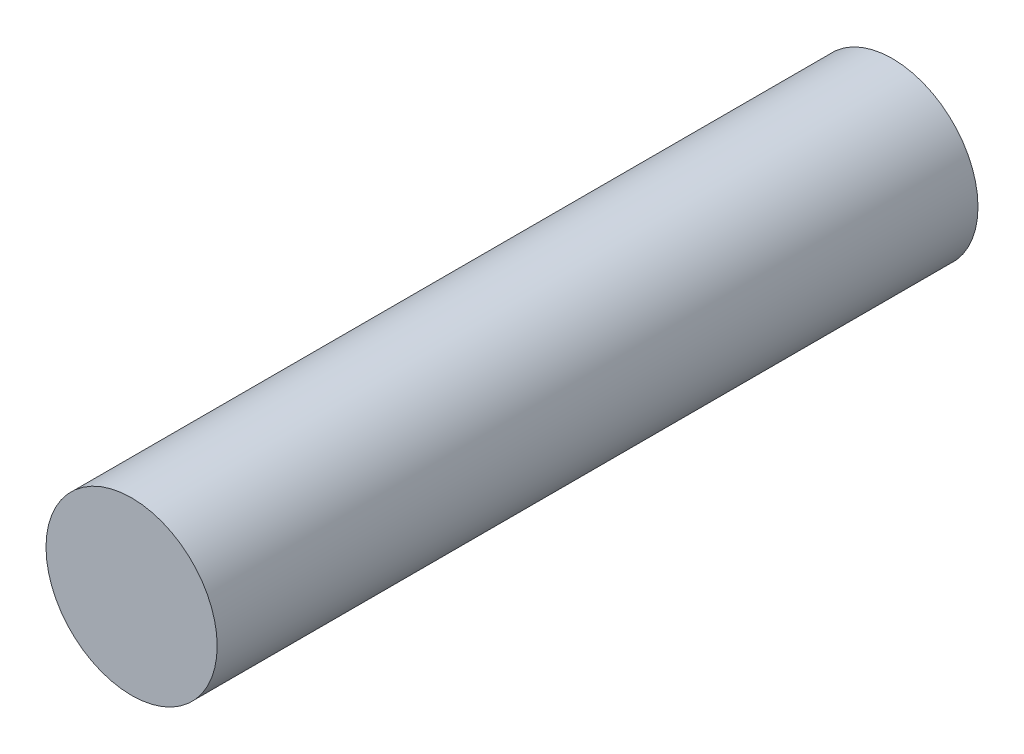
ISO-10303-21;
HEADER;
FILE_DESCRIPTION(('STEP AP214'),'2;1');
FILE_NAME('part.step','',(''),(''),'','','');
FILE_SCHEMA(('AUTOMOTIVE_DESIGN { 1 0 10303 214 1 1 1 1 }'));
ENDSEC;
DATA;
#1=APPLICATION_CONTEXT('core data for automotive mechanical design processes');
#2=APPLICATION_PROTOCOL_DEFINITION('international standard','automotive_design',2000,#1);
#3=PRODUCT_CONTEXT('',#1,'mechanical');
#4=PRODUCT('Part','Part','',(#3));
#5=PRODUCT_RELATED_PRODUCT_CATEGORY('part','',(#4));
#6=PRODUCT_DEFINITION_FORMATION('','',#4);
#7=PRODUCT_DEFINITION_CONTEXT('part definition',#1,'design');
#8=PRODUCT_DEFINITION('design','',#6,#7);
#9=PRODUCT_DEFINITION_SHAPE('','',#8);
#10=(LENGTH_UNIT() NAMED_UNIT(*) SI_UNIT(.MILLI.,.METRE.));
#11=(NAMED_UNIT(*) PLANE_ANGLE_UNIT() SI_UNIT($,.RADIAN.));
#12=(NAMED_UNIT(*) SI_UNIT($,.STERADIAN.) SOLID_ANGLE_UNIT());
#13=UNCERTAINTY_MEASURE_WITH_UNIT(LENGTH_MEASURE(1.E-05),#10,'distance_accuracy_value','');
#14=(GEOMETRIC_REPRESENTATION_CONTEXT(3) GLOBAL_UNCERTAINTY_ASSIGNED_CONTEXT((#13)) GLOBAL_UNIT_ASSIGNED_CONTEXT((#10,
#11,#12)) REPRESENTATION_CONTEXT('',''));
#15=CARTESIAN_POINT('',(0.,0.,0.));
#16=DIRECTION('',(0.,0.,1.));
#17=DIRECTION('',(1.,0.,0.));
#18=AXIS2_PLACEMENT_3D('',#15,#16,#17);
#19=CARTESIAN_POINT('',(0.,0.,40.));
#20=DIRECTION('',(0.,0.,-1.));
#21=DIRECTION('',(-1.,0.,0.));
#22=AXIS2_PLACEMENT_3D('',#19,#20,#21);
#23=CYLINDRICAL_SURFACE('',#22,4.5);
#24=CARTESIAN_POINT('',(0.,0.,40.));
#25=DIRECTION('',(0.,0.,1.));
#26=DIRECTION('',(1.,0.,0.));
#27=AXIS2_PLACEMENT_3D('',#24,#25,#26);
#28=CIRCLE('',#27,4.5);
#29=CARTESIAN_POINT('',(4.5,0.,40.));
#30=VERTEX_POINT('',#29);
#31=EDGE_CURVE('E10',#30,#30,#28,.T.);
#32=ORIENTED_EDGE('',*,*,#31,.F.);
#33=EDGE_LOOP('',(#32));
#34=FACE_BOUND('',#33,.T.);
#35=CARTESIAN_POINT('',(0.,0.,0.));
#36=DIRECTION('',(0.,0.,1.));
#37=DIRECTION('',(1.,0.,0.));
#38=AXIS2_PLACEMENT_3D('',#35,#36,#37);
#39=CIRCLE('',#38,4.5);
#40=CARTESIAN_POINT('',(4.5,0.,0.));
#41=VERTEX_POINT('',#40);
#42=EDGE_CURVE('E36',#41,#41,#39,.T.);
#43=ORIENTED_EDGE('',*,*,#42,.T.);
#44=EDGE_LOOP('',(#43));
#45=FACE_BOUND('',#44,.T.);
#46=ADVANCED_FACE('F33',(#34,#45),#23,.T.);
#47=CARTESIAN_POINT('',(0.,0.,40.));
#48=DIRECTION('',(0.,0.,1.));
#49=DIRECTION('',(1.,0.,0.));
#50=AXIS2_PLACEMENT_3D('',#47,#48,#49);
#51=PLANE('',#50);
#52=ORIENTED_EDGE('',*,*,#31,.T.);
#53=EDGE_LOOP('',(#52));
#54=FACE_BOUND('',#53,.T.);
#55=ADVANCED_FACE('F48',(#54),#51,.T.);
#56=CARTESIAN_POINT('',(0.,0.,0.));
#57=DIRECTION('',(0.,0.,1.));
#58=DIRECTION('',(1.,0.,0.));
#59=AXIS2_PLACEMENT_3D('',#56,#57,#58);
#60=PLANE('',#59);
#61=ORIENTED_EDGE('',*,*,#42,.F.);
#62=EDGE_LOOP('',(#61));
#63=FACE_BOUND('',#62,.T.);
#64=ADVANCED_FACE('F46',(#63),#60,.F.);
#65=CLOSED_SHELL('',(#46,#55,#64));
#66=MANIFOLD_SOLID_BREP('B2',#65);
#67=ADVANCED_BREP_SHAPE_REPRESENTATION('',(#18,#66),#14);
#68=SHAPE_DEFINITION_REPRESENTATION(#9,#67);
ENDSEC;
END-ISO-10303-21;
